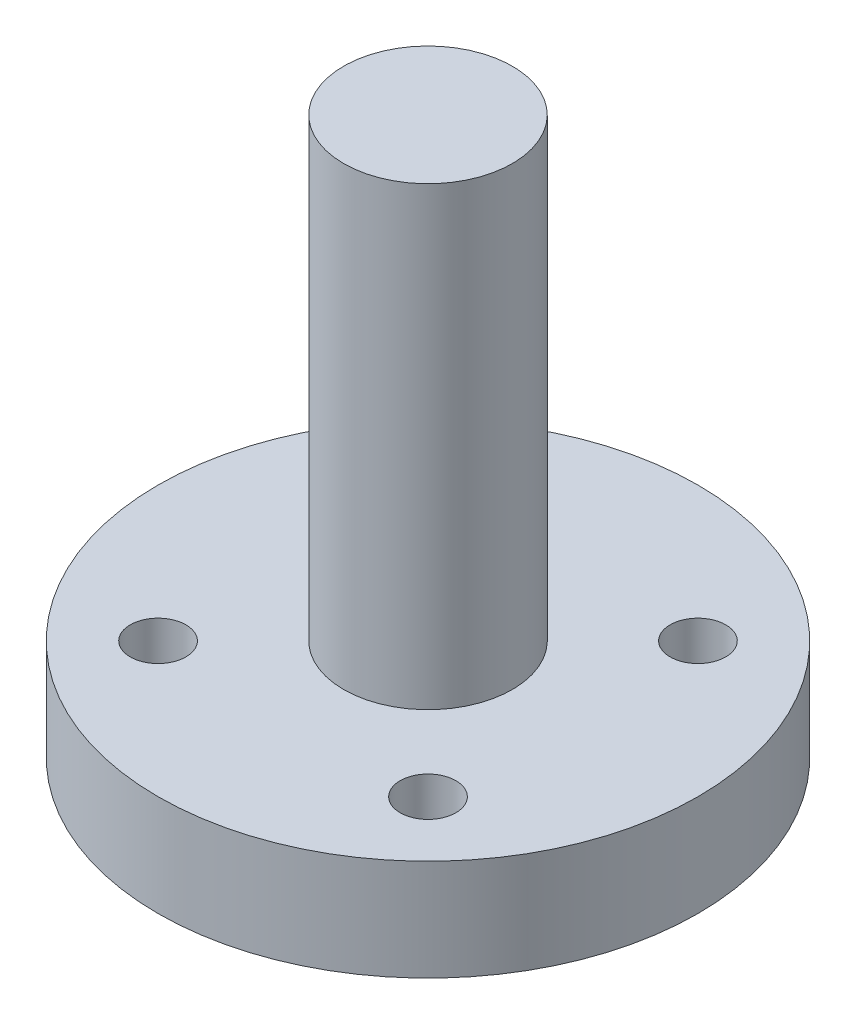
ISO-10303-21;
HEADER;
FILE_DESCRIPTION(('STEP AP214'),'2;1');
FILE_NAME('part.step','',(''),(''),'','','');
FILE_SCHEMA(('AUTOMOTIVE_DESIGN { 1 0 10303 214 1 1 1 1 }'));
ENDSEC;
DATA;
#1=APPLICATION_CONTEXT('core data for automotive mechanical design processes');
#2=APPLICATION_PROTOCOL_DEFINITION('international standard','automotive_design',2000,#1);
#3=PRODUCT_CONTEXT('',#1,'mechanical');
#4=PRODUCT('Part','Part','',(#3));
#5=PRODUCT_RELATED_PRODUCT_CATEGORY('part','',(#4));
#6=PRODUCT_DEFINITION_FORMATION('','',#4);
#7=PRODUCT_DEFINITION_CONTEXT('part definition',#1,'design');
#8=PRODUCT_DEFINITION('design','',#6,#7);
#9=PRODUCT_DEFINITION_SHAPE('','',#8);
#10=(LENGTH_UNIT() NAMED_UNIT(*) SI_UNIT(.MILLI.,.METRE.));
#11=(NAMED_UNIT(*) PLANE_ANGLE_UNIT() SI_UNIT($,.RADIAN.));
#12=(NAMED_UNIT(*) SI_UNIT($,.STERADIAN.) SOLID_ANGLE_UNIT());
#13=UNCERTAINTY_MEASURE_WITH_UNIT(LENGTH_MEASURE(1.E-05),#10,'distance_accuracy_value','');
#14=(GEOMETRIC_REPRESENTATION_CONTEXT(3) GLOBAL_UNCERTAINTY_ASSIGNED_CONTEXT((#13)) GLOBAL_UNIT_ASSIGNED_CONTEXT((#10,
#11,#12)) REPRESENTATION_CONTEXT('',''));
#15=CARTESIAN_POINT('',(0.,0.,0.));
#16=DIRECTION('',(0.,0.,1.));
#17=DIRECTION('',(1.,0.,0.));
#18=AXIS2_PLACEMENT_3D('',#15,#16,#17);
#19=CARTESIAN_POINT('',(0.,6.,0.));
#20=DIRECTION('',(0.,-1.,0.));
#21=DIRECTION('',(0.,0.,-1.));
#22=AXIS2_PLACEMENT_3D('',#19,#20,#21);
#23=CYLINDRICAL_SURFACE('',#22,16.);
#24=CARTESIAN_POINT('',(0.,6.,0.));
#25=DIRECTION('',(0.,1.,0.));
#26=DIRECTION('',(0.,0.,1.));
#27=AXIS2_PLACEMENT_3D('',#24,#25,#26);
#28=CIRCLE('',#27,16.);
#29=CARTESIAN_POINT('',(0.,6.,16.));
#30=VERTEX_POINT('',#29);
#31=EDGE_CURVE('E42',#30,#30,#28,.T.);
#32=ORIENTED_EDGE('',*,*,#31,.F.);
#33=EDGE_LOOP('',(#32));
#34=FACE_BOUND('',#33,.T.);
#35=CARTESIAN_POINT('',(0.,0.,0.));
#36=DIRECTION('',(0.,1.,0.));
#37=DIRECTION('',(0.,0.,1.));
#38=AXIS2_PLACEMENT_3D('',#35,#36,#37);
#39=CIRCLE('',#38,16.);
#40=CARTESIAN_POINT('',(0.,0.,16.));
#41=VERTEX_POINT('',#40);
#42=EDGE_CURVE('E38',#41,#41,#39,.T.);
#43=ORIENTED_EDGE('',*,*,#42,.T.);
#44=EDGE_LOOP('',(#43));
#45=FACE_BOUND('',#44,.T.);
#46=ADVANCED_FACE('F35',(#34,#45),#23,.T.);
#47=CARTESIAN_POINT('',(0.,6.,0.));
#48=DIRECTION('',(0.,1.,0.));
#49=DIRECTION('',(0.,0.,1.));
#50=AXIS2_PLACEMENT_3D('',#47,#48,#49);
#51=PLANE('',#50);
#52=CARTESIAN_POINT('',(0.,6.,0.));
#53=DIRECTION('',(0.,1.,0.));
#54=DIRECTION('',(0.,0.,1.));
#55=AXIS2_PLACEMENT_3D('',#52,#53,#54);
#56=CIRCLE('',#55,5.);
#57=CARTESIAN_POINT('',(0.,6.,5.));
#58=VERTEX_POINT('',#57);
#59=EDGE_CURVE('E10',#58,#58,#56,.T.);
#60=ORIENTED_EDGE('',*,*,#59,.F.);
#61=EDGE_LOOP('',(#60));
#62=FACE_BOUND('',#61,.T.);
#63=CARTESIAN_POINT('',(8.,6.,-8.));
#64=DIRECTION('',(0.,-1.,0.));
#65=DIRECTION('',(0.,0.,-1.));
#66=AXIS2_PLACEMENT_3D('',#63,#64,#65);
#67=CIRCLE('',#66,1.65);
#68=CARTESIAN_POINT('',(8.,6.,-9.65));
#69=VERTEX_POINT('',#68);
#70=EDGE_CURVE('E53',#69,#69,#67,.T.);
#71=ORIENTED_EDGE('',*,*,#70,.T.);
#72=EDGE_LOOP('',(#71));
#73=FACE_BOUND('',#72,.T.);
#74=CARTESIAN_POINT('',(7.99999999999999,6.,8.));
#75=DIRECTION('',(0.,-1.,0.));
#76=DIRECTION('',(0.,0.,-1.));
#77=AXIS2_PLACEMENT_3D('',#74,#75,#76);
#78=CIRCLE('',#77,1.65);
#79=CARTESIAN_POINT('',(7.99999999999999,6.,6.35));
#80=VERTEX_POINT('',#79);
#81=EDGE_CURVE('E59',#80,#80,#78,.T.);
#82=ORIENTED_EDGE('',*,*,#81,.T.);
#83=EDGE_LOOP('',(#82));
#84=FACE_BOUND('',#83,.T.);
#85=CARTESIAN_POINT('',(-8.,6.,8.));
#86=DIRECTION('',(0.,-1.,0.));
#87=DIRECTION('',(0.,0.,-1.));
#88=AXIS2_PLACEMENT_3D('',#85,#86,#87);
#89=CIRCLE('',#88,1.65);
#90=CARTESIAN_POINT('',(-8.,6.,6.35));
#91=VERTEX_POINT('',#90);
#92=EDGE_CURVE('E65',#91,#91,#89,.T.);
#93=ORIENTED_EDGE('',*,*,#92,.T.);
#94=EDGE_LOOP('',(#93));
#95=FACE_BOUND('',#94,.T.);
#96=CARTESIAN_POINT('',(-8.,6.,-8.));
#97=DIRECTION('',(0.,-1.,0.));
#98=DIRECTION('',(0.,0.,-1.));
#99=AXIS2_PLACEMENT_3D('',#96,#97,#98);
#100=CIRCLE('',#99,1.65);
#101=CARTESIAN_POINT('',(-8.,6.,-9.65));
#102=VERTEX_POINT('',#101);
#103=EDGE_CURVE('E71',#102,#102,#100,.T.);
#104=ORIENTED_EDGE('',*,*,#103,.T.);
#105=EDGE_LOOP('',(#104));
#106=FACE_BOUND('',#105,.T.);
#107=ORIENTED_EDGE('',*,*,#31,.T.);
#108=EDGE_LOOP('',(#107));
#109=FACE_BOUND('',#108,.T.);
#110=ADVANCED_FACE('F82',(#62,#73,#84,#95,#106,#109),#51,.T.);
#111=CARTESIAN_POINT('',(0.,0.,0.));
#112=DIRECTION('',(0.,1.,0.));
#113=DIRECTION('',(0.,0.,1.));
#114=AXIS2_PLACEMENT_3D('',#111,#112,#113);
#115=PLANE('',#114);
#116=CARTESIAN_POINT('',(8.,0.,-8.));
#117=DIRECTION('',(0.,-1.,0.));
#118=DIRECTION('',(0.,0.,-1.));
#119=AXIS2_PLACEMENT_3D('',#116,#117,#118);
#120=CIRCLE('',#119,1.64999999999999);
#121=CARTESIAN_POINT('',(8.,0.,-9.64999999999999));
#122=VERTEX_POINT('',#121);
#123=EDGE_CURVE('E50',#122,#122,#120,.T.);
#124=ORIENTED_EDGE('',*,*,#123,.F.);
#125=EDGE_LOOP('',(#124));
#126=FACE_BOUND('',#125,.T.);
#127=CARTESIAN_POINT('',(7.99999999999999,0.,8.));
#128=DIRECTION('',(0.,-1.,0.));
#129=DIRECTION('',(0.,0.,-1.));
#130=AXIS2_PLACEMENT_3D('',#127,#128,#129);
#131=CIRCLE('',#130,1.64999999999999);
#132=CARTESIAN_POINT('',(7.99999999999999,0.,6.35000000000001));
#133=VERTEX_POINT('',#132);
#134=EDGE_CURVE('E56',#133,#133,#131,.T.);
#135=ORIENTED_EDGE('',*,*,#134,.F.);
#136=EDGE_LOOP('',(#135));
#137=FACE_BOUND('',#136,.T.);
#138=CARTESIAN_POINT('',(-8.,0.,8.));
#139=DIRECTION('',(0.,-1.,0.));
#140=DIRECTION('',(0.,0.,-1.));
#141=AXIS2_PLACEMENT_3D('',#138,#139,#140);
#142=CIRCLE('',#141,1.64999999999999);
#143=CARTESIAN_POINT('',(-8.,0.,6.35000000000001));
#144=VERTEX_POINT('',#143);
#145=EDGE_CURVE('E62',#144,#144,#142,.T.);
#146=ORIENTED_EDGE('',*,*,#145,.F.);
#147=EDGE_LOOP('',(#146));
#148=FACE_BOUND('',#147,.T.);
#149=CARTESIAN_POINT('',(-8.,0.,-8.));
#150=DIRECTION('',(0.,-1.,0.));
#151=DIRECTION('',(0.,0.,-1.));
#152=AXIS2_PLACEMENT_3D('',#149,#150,#151);
#153=CIRCLE('',#152,1.64999999999999);
#154=CARTESIAN_POINT('',(-8.,0.,-9.64999999999999));
#155=VERTEX_POINT('',#154);
#156=EDGE_CURVE('E68',#155,#155,#153,.T.);
#157=ORIENTED_EDGE('',*,*,#156,.F.);
#158=EDGE_LOOP('',(#157));
#159=FACE_BOUND('',#158,.T.);
#160=ORIENTED_EDGE('',*,*,#42,.F.);
#161=EDGE_LOOP('',(#160));
#162=FACE_BOUND('',#161,.T.);
#163=ADVANCED_FACE('F79',(#126,#137,#148,#159,#162),#115,.F.);
#164=CARTESIAN_POINT('',(-8.,0.,-8.));
#165=DIRECTION('',(0.,-1.,0.));
#166=DIRECTION('',(0.,0.,-1.));
#167=AXIS2_PLACEMENT_3D('',#164,#165,#166);
#168=CYLINDRICAL_SURFACE('',#167,1.64999999999999);
#169=ORIENTED_EDGE('',*,*,#103,.F.);
#170=EDGE_LOOP('',(#169));
#171=FACE_BOUND('',#170,.T.);
#172=ORIENTED_EDGE('',*,*,#156,.T.);
#173=EDGE_LOOP('',(#172));
#174=FACE_BOUND('',#173,.T.);
#175=ADVANCED_FACE('F81',(#171,#174),#168,.F.);
#176=CARTESIAN_POINT('',(-8.,0.,8.));
#177=DIRECTION('',(0.,-1.,0.));
#178=DIRECTION('',(0.,0.,-1.));
#179=AXIS2_PLACEMENT_3D('',#176,#177,#178);
#180=CYLINDRICAL_SURFACE('',#179,1.64999999999999);
#181=ORIENTED_EDGE('',*,*,#92,.F.);
#182=EDGE_LOOP('',(#181));
#183=FACE_BOUND('',#182,.T.);
#184=ORIENTED_EDGE('',*,*,#145,.T.);
#185=EDGE_LOOP('',(#184));
#186=FACE_BOUND('',#185,.T.);
#187=ADVANCED_FACE('F88',(#183,#186),#180,.F.);
#188=CARTESIAN_POINT('',(7.99999999999999,0.,8.));
#189=DIRECTION('',(0.,-1.,0.));
#190=DIRECTION('',(0.,0.,-1.));
#191=AXIS2_PLACEMENT_3D('',#188,#189,#190);
#192=CYLINDRICAL_SURFACE('',#191,1.64999999999999);
#193=ORIENTED_EDGE('',*,*,#81,.F.);
#194=EDGE_LOOP('',(#193));
#195=FACE_BOUND('',#194,.T.);
#196=ORIENTED_EDGE('',*,*,#134,.T.);
#197=EDGE_LOOP('',(#196));
#198=FACE_BOUND('',#197,.T.);
#199=ADVANCED_FACE('F144',(#195,#198),#192,.F.);
#200=CARTESIAN_POINT('',(8.,0.,-8.));
#201=DIRECTION('',(0.,-1.,0.));
#202=DIRECTION('',(0.,0.,-1.));
#203=AXIS2_PLACEMENT_3D('',#200,#201,#202);
#204=CYLINDRICAL_SURFACE('',#203,1.64999999999999);
#205=ORIENTED_EDGE('',*,*,#70,.F.);
#206=EDGE_LOOP('',(#205));
#207=FACE_BOUND('',#206,.T.);
#208=ORIENTED_EDGE('',*,*,#123,.T.);
#209=EDGE_LOOP('',(#208));
#210=FACE_BOUND('',#209,.T.);
#211=ADVANCED_FACE('F113',(#207,#210),#204,.F.);
#212=CARTESIAN_POINT('',(0.,33.,0.));
#213=DIRECTION('',(0.,-1.,0.));
#214=DIRECTION('',(0.,0.,-1.));
#215=AXIS2_PLACEMENT_3D('',#212,#213,#214);
#216=CYLINDRICAL_SURFACE('',#215,5.);
#217=CARTESIAN_POINT('',(0.,33.,0.));
#218=DIRECTION('',(0.,1.,0.));
#219=DIRECTION('',(0.,0.,1.));
#220=AXIS2_PLACEMENT_3D('',#217,#218,#219);
#221=CIRCLE('',#220,5.);
#222=CARTESIAN_POINT('',(0.,33.,5.));
#223=VERTEX_POINT('',#222);
#224=EDGE_CURVE('E49',#223,#223,#221,.T.);
#225=ORIENTED_EDGE('',*,*,#224,.F.);
#226=EDGE_LOOP('',(#225));
#227=FACE_BOUND('',#226,.T.);
#228=ORIENTED_EDGE('',*,*,#59,.T.);
#229=EDGE_LOOP('',(#228));
#230=FACE_BOUND('',#229,.T.);
#231=ADVANCED_FACE('F118',(#227,#230),#216,.T.);
#232=CARTESIAN_POINT('',(0.,33.,0.));
#233=DIRECTION('',(0.,1.,0.));
#234=DIRECTION('',(0.,0.,1.));
#235=AXIS2_PLACEMENT_3D('',#232,#233,#234);
#236=PLANE('',#235);
#237=ORIENTED_EDGE('',*,*,#224,.T.);
#238=EDGE_LOOP('',(#237));
#239=FACE_BOUND('',#238,.T.);
#240=ADVANCED_FACE('F123',(#239),#236,.T.);
#241=CLOSED_SHELL('',(#46,#110,#163,#175,#187,#199,#211,#231,#240));
#242=MANIFOLD_SOLID_BREP('B2',#241);
#243=ADVANCED_BREP_SHAPE_REPRESENTATION('',(#18,#242),#14);
#244=SHAPE_DEFINITION_REPRESENTATION(#9,#243);
ENDSEC;
END-ISO-10303-21;
